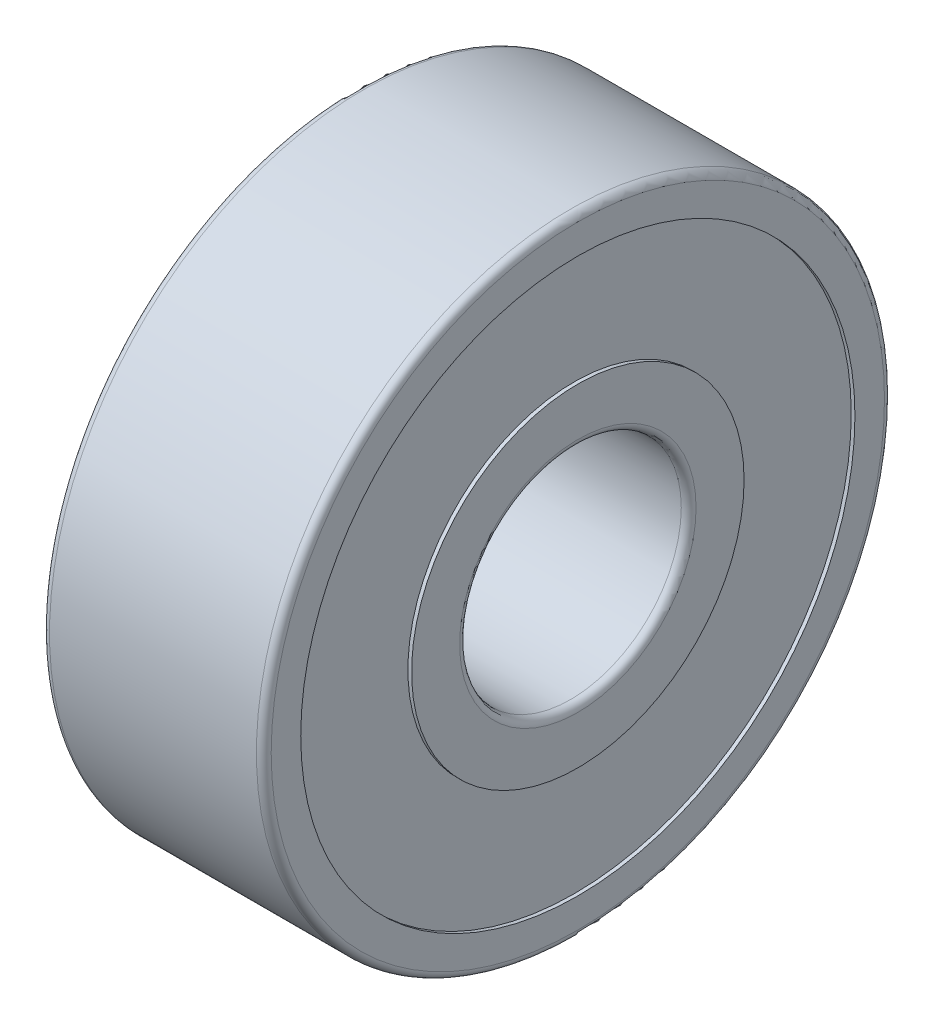
ISO-10303-21;
HEADER;
FILE_DESCRIPTION(('STEP AP214'),'2;1');
FILE_NAME('part.step','',(''),(''),'','','');
FILE_SCHEMA(('AUTOMOTIVE_DESIGN { 1 0 10303 214 1 1 1 1 }'));
ENDSEC;
DATA;
#1=APPLICATION_CONTEXT('core data for automotive mechanical design processes');
#2=APPLICATION_PROTOCOL_DEFINITION('international standard','automotive_design',2000,#1);
#3=PRODUCT_CONTEXT('',#1,'mechanical');
#4=PRODUCT('Part','Part','',(#3));
#5=PRODUCT_RELATED_PRODUCT_CATEGORY('part','',(#4));
#6=PRODUCT_DEFINITION_FORMATION('','',#4);
#7=PRODUCT_DEFINITION_CONTEXT('part definition',#1,'design');
#8=PRODUCT_DEFINITION('design','',#6,#7);
#9=PRODUCT_DEFINITION_SHAPE('','',#8);
#10=(LENGTH_UNIT() NAMED_UNIT(*) SI_UNIT(.MILLI.,.METRE.));
#11=(NAMED_UNIT(*) PLANE_ANGLE_UNIT() SI_UNIT($,.RADIAN.));
#12=(NAMED_UNIT(*) SI_UNIT($,.STERADIAN.) SOLID_ANGLE_UNIT());
#13=UNCERTAINTY_MEASURE_WITH_UNIT(LENGTH_MEASURE(1.E-05),#10,'distance_accuracy_value','');
#14=(GEOMETRIC_REPRESENTATION_CONTEXT(3) GLOBAL_UNCERTAINTY_ASSIGNED_CONTEXT((#13)) GLOBAL_UNIT_ASSIGNED_CONTEXT((#10,
#11,#12)) REPRESENTATION_CONTEXT('',''));
#15=CARTESIAN_POINT('',(0.,0.,0.));
#16=DIRECTION('',(0.,0.,1.));
#17=DIRECTION('',(1.,0.,0.));
#18=AXIS2_PLACEMENT_3D('',#15,#16,#17);
#19=CARTESIAN_POINT('',(0.,0.,0.));
#20=DIRECTION('',(1.,0.,0.));
#21=DIRECTION('',(0.,0.,-1.));
#22=AXIS2_PLACEMENT_3D('',#19,#20,#21);
#23=PLANE('',#22);
#24=CARTESIAN_POINT('',(0.,0.,0.));
#25=DIRECTION('',(1.,0.,0.));
#26=DIRECTION('',(0.,0.,-1.));
#27=AXIS2_PLACEMENT_3D('',#24,#25,#26);
#28=CIRCLE('',#27,3.2);
#29=CARTESIAN_POINT('',(0.,0.,-3.2));
#30=VERTEX_POINT('',#29);
#31=EDGE_CURVE('E42',#30,#30,#28,.T.);
#32=ORIENTED_EDGE('',*,*,#31,.T.);
#33=EDGE_LOOP('',(#32));
#34=FACE_BOUND('',#33,.T.);
#35=CARTESIAN_POINT('',(0.,0.,0.));
#36=DIRECTION('',(-1.,0.,0.));
#37=DIRECTION('',(0.,0.,1.));
#38=AXIS2_PLACEMENT_3D('',#35,#36,#37);
#39=CIRCLE('',#38,4.5);
#40=CARTESIAN_POINT('',(0.,0.,4.5));
#41=VERTEX_POINT('',#40);
#42=EDGE_CURVE('E99',#41,#41,#39,.T.);
#43=ORIENTED_EDGE('',*,*,#42,.T.);
#44=EDGE_LOOP('',(#43));
#45=FACE_BOUND('',#44,.T.);
#46=ADVANCED_FACE('F34',(#34,#45),#23,.F.);
#47=CARTESIAN_POINT('',(6.,0.,0.));
#48=DIRECTION('',(1.,0.,0.));
#49=DIRECTION('',(0.,0.,-1.));
#50=AXIS2_PLACEMENT_3D('',#47,#48,#49);
#51=PLANE('',#50);
#52=CARTESIAN_POINT('',(6.,0.,0.));
#53=DIRECTION('',(1.,0.,0.));
#54=DIRECTION('',(0.,0.,-1.));
#55=AXIS2_PLACEMENT_3D('',#52,#53,#54);
#56=CIRCLE('',#55,3.2);
#57=CARTESIAN_POINT('',(6.,0.,-3.2));
#58=VERTEX_POINT('',#57);
#59=EDGE_CURVE('E65',#58,#58,#56,.F.);
#60=ORIENTED_EDGE('',*,*,#59,.T.);
#61=EDGE_LOOP('',(#60));
#62=FACE_BOUND('',#61,.T.);
#63=CARTESIAN_POINT('',(6.,0.,0.));
#64=DIRECTION('',(1.,0.,0.));
#65=DIRECTION('',(0.,0.,-1.));
#66=AXIS2_PLACEMENT_3D('',#63,#64,#65);
#67=CIRCLE('',#66,4.5);
#68=CARTESIAN_POINT('',(6.,0.,-4.5));
#69=VERTEX_POINT('',#68);
#70=EDGE_CURVE('E84',#69,#69,#67,.T.);
#71=ORIENTED_EDGE('',*,*,#70,.T.);
#72=EDGE_LOOP('',(#71));
#73=FACE_BOUND('',#72,.T.);
#74=ADVANCED_FACE('F135',(#62,#73),#51,.T.);
#75=CARTESIAN_POINT('',(6.,0.,0.));
#76=DIRECTION('',(1.,0.,0.));
#77=DIRECTION('',(0.,0.,-1.));
#78=AXIS2_PLACEMENT_3D('',#75,#76,#77);
#79=CIRCLE('',#78,8.3);
#80=CARTESIAN_POINT('',(6.,0.,-8.3));
#81=VERTEX_POINT('',#80);
#82=EDGE_CURVE('E61',#81,#81,#79,.T.);
#83=ORIENTED_EDGE('',*,*,#82,.T.);
#84=EDGE_LOOP('',(#83));
#85=FACE_BOUND('',#84,.T.);
#86=CARTESIAN_POINT('',(6.,0.,0.));
#87=DIRECTION('',(1.,0.,0.));
#88=DIRECTION('',(0.,0.,-1.));
#89=AXIS2_PLACEMENT_3D('',#86,#87,#88);
#90=CIRCLE('',#89,7.5);
#91=CARTESIAN_POINT('',(6.,0.,-7.5));
#92=VERTEX_POINT('',#91);
#93=EDGE_CURVE('E77',#92,#92,#90,.T.);
#94=ORIENTED_EDGE('',*,*,#93,.F.);
#95=EDGE_LOOP('',(#94));
#96=FACE_BOUND('',#95,.T.);
#97=ADVANCED_FACE('F126',(#85,#96),#51,.T.);
#98=CARTESIAN_POINT('',(0.,0.,0.));
#99=DIRECTION('',(1.,0.,0.));
#100=DIRECTION('',(0.,0.,-1.));
#101=AXIS2_PLACEMENT_3D('',#98,#99,#100);
#102=CIRCLE('',#101,8.3);
#103=CARTESIAN_POINT('',(0.,0.,-8.3));
#104=VERTEX_POINT('',#103);
#105=EDGE_CURVE('E10',#104,#104,#102,.F.);
#106=ORIENTED_EDGE('',*,*,#105,.T.);
#107=EDGE_LOOP('',(#106));
#108=FACE_BOUND('',#107,.T.);
#109=CARTESIAN_POINT('',(0.,0.,0.));
#110=DIRECTION('',(-1.,0.,0.));
#111=DIRECTION('',(0.,0.,1.));
#112=AXIS2_PLACEMENT_3D('',#109,#110,#111);
#113=CIRCLE('',#112,7.5);
#114=CARTESIAN_POINT('',(0.,0.,7.5));
#115=VERTEX_POINT('',#114);
#116=EDGE_CURVE('E92',#115,#115,#113,.T.);
#117=ORIENTED_EDGE('',*,*,#116,.F.);
#118=EDGE_LOOP('',(#117));
#119=FACE_BOUND('',#118,.T.);
#120=ADVANCED_FACE('F123',(#108,#119),#23,.F.);
#121=CARTESIAN_POINT('',(6.,0.,0.));
#122=DIRECTION('',(-1.,0.,0.));
#123=DIRECTION('',(0.,0.,1.));
#124=AXIS2_PLACEMENT_3D('',#121,#122,#123);
#125=CYLINDRICAL_SURFACE('',#124,8.5);
#126=CARTESIAN_POINT('',(5.8,0.,0.));
#127=DIRECTION('',(1.,0.,0.));
#128=DIRECTION('',(0.,0.,-1.));
#129=AXIS2_PLACEMENT_3D('',#126,#127,#128);
#130=CIRCLE('',#129,8.5);
#131=CARTESIAN_POINT('',(5.8,0.,-8.5));
#132=VERTEX_POINT('',#131);
#133=EDGE_CURVE('E49',#132,#132,#130,.F.);
#134=ORIENTED_EDGE('',*,*,#133,.T.);
#135=EDGE_LOOP('',(#134));
#136=FACE_BOUND('',#135,.T.);
#137=CARTESIAN_POINT('',(0.2,0.,0.));
#138=DIRECTION('',(1.,0.,0.));
#139=DIRECTION('',(0.,0.,-1.));
#140=AXIS2_PLACEMENT_3D('',#137,#138,#139);
#141=CIRCLE('',#140,8.5);
#142=CARTESIAN_POINT('',(0.2,0.,-8.5));
#143=VERTEX_POINT('',#142);
#144=EDGE_CURVE('E56',#143,#143,#141,.T.);
#145=ORIENTED_EDGE('',*,*,#144,.T.);
#146=EDGE_LOOP('',(#145));
#147=FACE_BOUND('',#146,.T.);
#148=ADVANCED_FACE('F125',(#136,#147),#125,.T.);
#149=CARTESIAN_POINT('',(6.,0.,0.));
#150=DIRECTION('',(-1.,0.,0.));
#151=DIRECTION('',(0.,0.,1.));
#152=AXIS2_PLACEMENT_3D('',#149,#150,#151);
#153=CYLINDRICAL_SURFACE('',#152,3.);
#154=CARTESIAN_POINT('',(5.8,0.,0.));
#155=DIRECTION('',(1.,0.,0.));
#156=DIRECTION('',(0.,0.,-1.));
#157=AXIS2_PLACEMENT_3D('',#154,#155,#156);
#158=CIRCLE('',#157,3.);
#159=CARTESIAN_POINT('',(5.8,0.,-3.));
#160=VERTEX_POINT('',#159);
#161=EDGE_CURVE('E69',#160,#160,#158,.T.);
#162=ORIENTED_EDGE('',*,*,#161,.T.);
#163=EDGE_LOOP('',(#162));
#164=FACE_BOUND('',#163,.T.);
#165=CARTESIAN_POINT('',(0.2,0.,0.));
#166=DIRECTION('',(1.,0.,0.));
#167=DIRECTION('',(0.,0.,-1.));
#168=AXIS2_PLACEMENT_3D('',#165,#166,#167);
#169=CIRCLE('',#168,3.);
#170=CARTESIAN_POINT('',(0.2,0.,-3.));
#171=VERTEX_POINT('',#170);
#172=EDGE_CURVE('E73',#171,#171,#169,.F.);
#173=ORIENTED_EDGE('',*,*,#172,.T.);
#174=EDGE_LOOP('',(#173));
#175=FACE_BOUND('',#174,.T.);
#176=ADVANCED_FACE('F132',(#164,#175),#153,.F.);
#177=CARTESIAN_POINT('',(5.9,0.,0.));
#178=DIRECTION('',(1.,0.,0.));
#179=DIRECTION('',(0.,0.,-1.));
#180=AXIS2_PLACEMENT_3D('',#177,#178,#179);
#181=CYLINDRICAL_SURFACE('',#180,7.5);
#182=CARTESIAN_POINT('',(5.9,0.,0.));
#183=DIRECTION('',(1.,0.,0.));
#184=DIRECTION('',(0.,0.,-1.));
#185=AXIS2_PLACEMENT_3D('',#182,#183,#184);
#186=CIRCLE('',#185,7.5);
#187=CARTESIAN_POINT('',(5.9,0.,-7.5));
#188=VERTEX_POINT('',#187);
#189=EDGE_CURVE('E76',#188,#188,#186,.T.);
#190=ORIENTED_EDGE('',*,*,#189,.F.);
#191=EDGE_LOOP('',(#190));
#192=FACE_BOUND('',#191,.T.);
#193=ORIENTED_EDGE('',*,*,#93,.T.);
#194=EDGE_LOOP('',(#193));
#195=FACE_BOUND('',#194,.T.);
#196=ADVANCED_FACE('F161',(#192,#195),#181,.F.);
#197=CARTESIAN_POINT('',(5.9,0.,0.));
#198=DIRECTION('',(1.,0.,0.));
#199=DIRECTION('',(0.,0.,-1.));
#200=AXIS2_PLACEMENT_3D('',#197,#198,#199);
#201=PLANE('',#200);
#202=CARTESIAN_POINT('',(5.9,0.,0.));
#203=DIRECTION('',(1.,0.,0.));
#204=DIRECTION('',(0.,0.,-1.));
#205=AXIS2_PLACEMENT_3D('',#202,#203,#204);
#206=CIRCLE('',#205,4.5);
#207=CARTESIAN_POINT('',(5.9,0.,-4.5));
#208=VERTEX_POINT('',#207);
#209=EDGE_CURVE('E81',#208,#208,#206,.T.);
#210=ORIENTED_EDGE('',*,*,#209,.F.);
#211=EDGE_LOOP('',(#210));
#212=FACE_BOUND('',#211,.T.);
#213=ORIENTED_EDGE('',*,*,#189,.T.);
#214=EDGE_LOOP('',(#213));
#215=FACE_BOUND('',#214,.T.);
#216=ADVANCED_FACE('F157',(#212,#215),#201,.T.);
#217=CARTESIAN_POINT('',(5.9,0.,0.));
#218=DIRECTION('',(1.,0.,0.));
#219=DIRECTION('',(0.,0.,-1.));
#220=AXIS2_PLACEMENT_3D('',#217,#218,#219);
#221=CYLINDRICAL_SURFACE('',#220,4.5);
#222=ORIENTED_EDGE('',*,*,#209,.T.);
#223=EDGE_LOOP('',(#222));
#224=FACE_BOUND('',#223,.T.);
#225=ORIENTED_EDGE('',*,*,#70,.F.);
#226=EDGE_LOOP('',(#225));
#227=FACE_BOUND('',#226,.T.);
#228=ADVANCED_FACE('F119',(#224,#227),#221,.T.);
#229=CARTESIAN_POINT('',(0.1,0.,0.));
#230=DIRECTION('',(-1.,0.,0.));
#231=DIRECTION('',(0.,0.,1.));
#232=AXIS2_PLACEMENT_3D('',#229,#230,#231);
#233=CYLINDRICAL_SURFACE('',#232,7.5);
#234=CARTESIAN_POINT('',(0.1,0.,0.));
#235=DIRECTION('',(-1.,0.,0.));
#236=DIRECTION('',(0.,0.,1.));
#237=AXIS2_PLACEMENT_3D('',#234,#235,#236);
#238=CIRCLE('',#237,7.5);
#239=CARTESIAN_POINT('',(0.1,0.,7.5));
#240=VERTEX_POINT('',#239);
#241=EDGE_CURVE('E88',#240,#240,#238,.T.);
#242=ORIENTED_EDGE('',*,*,#241,.F.);
#243=EDGE_LOOP('',(#242));
#244=FACE_BOUND('',#243,.T.);
#245=ORIENTED_EDGE('',*,*,#116,.T.);
#246=EDGE_LOOP('',(#245));
#247=FACE_BOUND('',#246,.T.);
#248=ADVANCED_FACE('F113',(#244,#247),#233,.F.);
#249=CARTESIAN_POINT('',(0.1,0.,0.));
#250=DIRECTION('',(-1.,0.,0.));
#251=DIRECTION('',(0.,0.,1.));
#252=AXIS2_PLACEMENT_3D('',#249,#250,#251);
#253=PLANE('',#252);
#254=CARTESIAN_POINT('',(0.1,0.,0.));
#255=DIRECTION('',(-1.,0.,0.));
#256=DIRECTION('',(0.,0.,1.));
#257=AXIS2_PLACEMENT_3D('',#254,#255,#256);
#258=CIRCLE('',#257,4.5);
#259=CARTESIAN_POINT('',(0.1,0.,4.5));
#260=VERTEX_POINT('',#259);
#261=EDGE_CURVE('E96',#260,#260,#258,.T.);
#262=ORIENTED_EDGE('',*,*,#261,.F.);
#263=EDGE_LOOP('',(#262));
#264=FACE_BOUND('',#263,.T.);
#265=ORIENTED_EDGE('',*,*,#241,.T.);
#266=EDGE_LOOP('',(#265));
#267=FACE_BOUND('',#266,.T.);
#268=ADVANCED_FACE('F110',(#264,#267),#253,.T.);
#269=CARTESIAN_POINT('',(0.1,0.,0.));
#270=DIRECTION('',(-1.,0.,0.));
#271=DIRECTION('',(0.,0.,1.));
#272=AXIS2_PLACEMENT_3D('',#269,#270,#271);
#273=CYLINDRICAL_SURFACE('',#272,4.5);
#274=ORIENTED_EDGE('',*,*,#261,.T.);
#275=EDGE_LOOP('',(#274));
#276=FACE_BOUND('',#275,.T.);
#277=ORIENTED_EDGE('',*,*,#42,.F.);
#278=EDGE_LOOP('',(#277));
#279=FACE_BOUND('',#278,.T.);
#280=ADVANCED_FACE('F107',(#276,#279),#273,.T.);
#281=CARTESIAN_POINT('',(5.8,0.,0.));
#282=DIRECTION('',(1.,0.,0.));
#283=DIRECTION('',(0.,0.,-1.));
#284=AXIS2_PLACEMENT_3D('',#281,#282,#283);
#285=TOROIDAL_SURFACE('',#284,3.2,0.2);
#286=ORIENTED_EDGE('',*,*,#59,.F.);
#287=EDGE_LOOP('',(#286));
#288=FACE_BOUND('',#287,.T.);
#289=ORIENTED_EDGE('',*,*,#161,.F.);
#290=EDGE_LOOP('',(#289));
#291=FACE_BOUND('',#290,.T.);
#292=ADVANCED_FACE('F146',(#288,#291),#285,.T.);
#293=CARTESIAN_POINT('',(5.8,0.,0.));
#294=DIRECTION('',(1.,0.,0.));
#295=DIRECTION('',(0.,0.,-1.));
#296=AXIS2_PLACEMENT_3D('',#293,#294,#295);
#297=TOROIDAL_SURFACE('',#296,8.3,0.2);
#298=ORIENTED_EDGE('',*,*,#133,.F.);
#299=EDGE_LOOP('',(#298));
#300=FACE_BOUND('',#299,.T.);
#301=ORIENTED_EDGE('',*,*,#82,.F.);
#302=EDGE_LOOP('',(#301));
#303=FACE_BOUND('',#302,.T.);
#304=ADVANCED_FACE('F151',(#300,#303),#297,.T.);
#305=CARTESIAN_POINT('',(0.2,0.,0.));
#306=DIRECTION('',(1.,0.,0.));
#307=DIRECTION('',(0.,0.,-1.));
#308=AXIS2_PLACEMENT_3D('',#305,#306,#307);
#309=TOROIDAL_SURFACE('',#308,3.2,0.2);
#310=ORIENTED_EDGE('',*,*,#172,.F.);
#311=EDGE_LOOP('',(#310));
#312=FACE_BOUND('',#311,.T.);
#313=ORIENTED_EDGE('',*,*,#31,.F.);
#314=EDGE_LOOP('',(#313));
#315=FACE_BOUND('',#314,.T.);
#316=ADVANCED_FACE('F174',(#312,#315),#309,.T.);
#317=CARTESIAN_POINT('',(0.2,0.,0.));
#318=DIRECTION('',(1.,0.,0.));
#319=DIRECTION('',(0.,0.,-1.));
#320=AXIS2_PLACEMENT_3D('',#317,#318,#319);
#321=TOROIDAL_SURFACE('',#320,8.3,0.2);
#322=ORIENTED_EDGE('',*,*,#105,.F.);
#323=EDGE_LOOP('',(#322));
#324=FACE_BOUND('',#323,.T.);
#325=ORIENTED_EDGE('',*,*,#144,.F.);
#326=EDGE_LOOP('',(#325));
#327=FACE_BOUND('',#326,.T.);
#328=ADVANCED_FACE('F36',(#324,#327),#321,.T.);
#329=CLOSED_SHELL('',(#46,#74,#97,#120,#148,#176,#196,#216,#228,#248,#268,#280,#292,#304,#316,#328));
#330=MANIFOLD_SOLID_BREP('B2',#329);
#331=ADVANCED_BREP_SHAPE_REPRESENTATION('',(#18,#330),#14);
#332=SHAPE_DEFINITION_REPRESENTATION(#9,#331);
ENDSEC;
END-ISO-10303-21;
